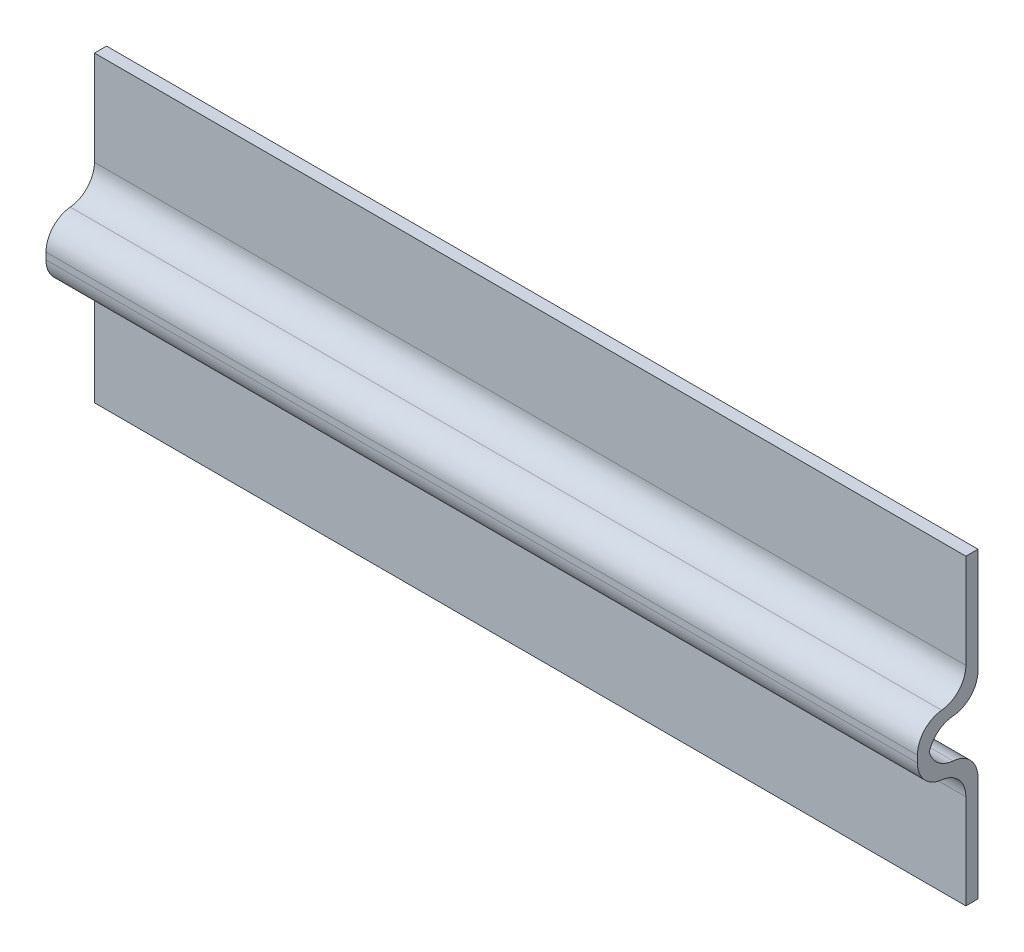
ISO-10303-21;
HEADER;
FILE_DESCRIPTION(('STEP AP214'),'2;1');
FILE_NAME('part.step','',(''),(''),'','','');
FILE_SCHEMA(('AUTOMOTIVE_DESIGN { 1 0 10303 214 1 1 1 1 }'));
ENDSEC;
DATA;
#1=APPLICATION_CONTEXT('core data for automotive mechanical design processes');
#2=APPLICATION_PROTOCOL_DEFINITION('international standard','automotive_design',2000,#1);
#3=PRODUCT_CONTEXT('',#1,'mechanical');
#4=PRODUCT('Part','Part','',(#3));
#5=PRODUCT_RELATED_PRODUCT_CATEGORY('part','',(#4));
#6=PRODUCT_DEFINITION_FORMATION('','',#4);
#7=PRODUCT_DEFINITION_CONTEXT('part definition',#1,'design');
#8=PRODUCT_DEFINITION('design','',#6,#7);
#9=PRODUCT_DEFINITION_SHAPE('','',#8);
#10=(LENGTH_UNIT() NAMED_UNIT(*) SI_UNIT(.MILLI.,.METRE.));
#11=(NAMED_UNIT(*) PLANE_ANGLE_UNIT() SI_UNIT($,.RADIAN.));
#12=(NAMED_UNIT(*) SI_UNIT($,.STERADIAN.) SOLID_ANGLE_UNIT());
#13=UNCERTAINTY_MEASURE_WITH_UNIT(LENGTH_MEASURE(1.E-05),#10,'distance_accuracy_value','');
#14=(GEOMETRIC_REPRESENTATION_CONTEXT(3) GLOBAL_UNCERTAINTY_ASSIGNED_CONTEXT((#13)) GLOBAL_UNIT_ASSIGNED_CONTEXT((#10,
#11,#12)) REPRESENTATION_CONTEXT('',''));
#15=CARTESIAN_POINT('',(0.,0.,0.));
#16=DIRECTION('',(0.,0.,1.));
#17=DIRECTION('',(1.,0.,0.));
#18=AXIS2_PLACEMENT_3D('',#15,#16,#17);
#19=CARTESIAN_POINT('',(-161.965,0.,0.));
#20=DIRECTION('',(0.,0.,-1.));
#21=DIRECTION('',(0.,1.,0.));
#22=AXIS2_PLACEMENT_3D('',#19,#20,#21);
#23=PLANE('',#22);
#24=DIRECTION('',(0.,1.,0.));
#25=VECTOR('',#24,1.);
#26=CARTESIAN_POINT('',(-161.965,0.,0.));
#27=LINE('',#26,#25);
#28=CARTESIAN_POINT('',(-161.965,0.,0.));
#29=VERTEX_POINT('',#28);
#30=CARTESIAN_POINT('',(-161.965,39.0937012998243,0.));
#31=VERTEX_POINT('',#30);
#32=EDGE_CURVE('E161',#29,#31,#27,.T.);
#33=ORIENTED_EDGE('',*,*,#32,.T.);
#34=DIRECTION('',(1.,0.,0.));
#35=VECTOR('',#34,1.);
#36=CARTESIAN_POINT('',(161.965,39.0937012998243,0.));
#37=LINE('',#36,#35);
#38=CARTESIAN_POINT('',(161.965,39.0937012998243,0.));
#39=VERTEX_POINT('',#38);
#40=EDGE_CURVE('E247',#31,#39,#37,.T.);
#41=ORIENTED_EDGE('',*,*,#40,.T.);
#42=DIRECTION('',(0.,1.,0.));
#43=VECTOR('',#42,1.);
#44=CARTESIAN_POINT('',(161.965,0.,0.));
#45=LINE('',#44,#43);
#46=CARTESIAN_POINT('',(161.965,0.,0.));
#47=VERTEX_POINT('',#46);
#48=EDGE_CURVE('E186',#47,#39,#45,.T.);
#49=ORIENTED_EDGE('',*,*,#48,.F.);
#50=DIRECTION('',(1.,0.,0.));
#51=VECTOR('',#50,1.);
#52=CARTESIAN_POINT('',(-161.965,0.,0.));
#53=LINE('',#52,#51);
#54=EDGE_CURVE('E203',#29,#47,#53,.T.);
#55=ORIENTED_EDGE('',*,*,#54,.F.);
#56=EDGE_LOOP('',(#33,#41,#49,#55));
#57=FACE_BOUND('',#56,.T.);
#58=ADVANCED_FACE('F43',(#57),#23,.T.);
#59=CARTESIAN_POINT('',(-161.965,0.,0.));
#60=DIRECTION('',(0.,-1.,0.));
#61=DIRECTION('',(0.,0.,-1.));
#62=AXIS2_PLACEMENT_3D('',#59,#60,#61);
#63=PLANE('',#62);
#64=DIRECTION('',(0.,0.,-1.));
#65=VECTOR('',#64,1.);
#66=CARTESIAN_POINT('',(161.965,0.,0.));
#67=LINE('',#66,#65);
#68=CARTESIAN_POINT('',(161.965,0.,4.50388224287594));
#69=VERTEX_POINT('',#68);
#70=EDGE_CURVE('E200',#69,#47,#67,.T.);
#71=ORIENTED_EDGE('',*,*,#70,.F.);
#72=DIRECTION('',(1.,0.,0.));
#73=VECTOR('',#72,1.);
#74=CARTESIAN_POINT('',(-161.965,0.,4.50388224287594));
#75=LINE('',#74,#73);
#76=CARTESIAN_POINT('',(-161.965,0.,4.50388224287594));
#77=VERTEX_POINT('',#76);
#78=EDGE_CURVE('E206',#77,#69,#75,.T.);
#79=ORIENTED_EDGE('',*,*,#78,.F.);
#80=DIRECTION('',(0.,0.,-1.));
#81=VECTOR('',#80,1.);
#82=CARTESIAN_POINT('',(-161.965,0.,0.));
#83=LINE('',#82,#81);
#84=EDGE_CURVE('E169',#77,#29,#83,.T.);
#85=ORIENTED_EDGE('',*,*,#84,.T.);
#86=ORIENTED_EDGE('',*,*,#54,.T.);
#87=EDGE_LOOP('',(#71,#79,#85,#86));
#88=FACE_BOUND('',#87,.T.);
#89=ADVANCED_FACE('F296',(#88),#63,.T.);
#90=CARTESIAN_POINT('',(-161.965,0.,4.50388224287594));
#91=DIRECTION('',(0.,0.,1.));
#92=DIRECTION('',(0.,-1.,0.));
#93=AXIS2_PLACEMENT_3D('',#90,#91,#92);
#94=PLANE('',#93);
#95=DIRECTION('',(0.,-1.,0.));
#96=VECTOR('',#95,1.);
#97=CARTESIAN_POINT('',(161.965,0.,4.50388224287594));
#98=LINE('',#97,#96);
#99=CARTESIAN_POINT('',(161.965,35.1375190860871,4.50388224287594));
#100=VERTEX_POINT('',#99);
#101=EDGE_CURVE('E198',#100,#69,#98,.T.);
#102=ORIENTED_EDGE('',*,*,#101,.F.);
#103=DIRECTION('',(-1.,0.,0.));
#104=VECTOR('',#103,1.);
#105=CARTESIAN_POINT('',(-161.965,35.1375190860871,4.50388224287594));
#106=LINE('',#105,#104);
#107=CARTESIAN_POINT('',(-161.965,35.1375190860871,4.50388224287594));
#108=VERTEX_POINT('',#107);
#109=EDGE_CURVE('E255',#100,#108,#106,.T.);
#110=ORIENTED_EDGE('',*,*,#109,.T.);
#111=DIRECTION('',(0.,-1.,0.));
#112=VECTOR('',#111,1.);
#113=CARTESIAN_POINT('',(-161.965,0.,4.50388224287594));
#114=LINE('',#113,#112);
#115=EDGE_CURVE('E182',#108,#77,#114,.T.);
#116=ORIENTED_EDGE('',*,*,#115,.T.);
#117=ORIENTED_EDGE('',*,*,#78,.T.);
#118=EDGE_LOOP('',(#102,#110,#116,#117));
#119=FACE_BOUND('',#118,.T.);
#120=ADVANCED_FACE('F327',(#119),#94,.T.);
#121=CARTESIAN_POINT('',(-161.965,67.5582336431391,22.5194112143797));
#122=DIRECTION('',(0.,0.,1.));
#123=DIRECTION('',(1.,0.,0.));
#124=AXIS2_PLACEMENT_3D('',#121,#122,#123);
#125=PLANE('',#124);
#126=DIRECTION('',(0.,-1.,0.));
#127=VECTOR('',#126,1.);
#128=CARTESIAN_POINT('',(-161.965,67.5582336431391,22.5194112143797));
#129=LINE('',#128,#127);
#130=CARTESIAN_POINT('',(-161.965,57.5582336431391,22.5194112143797));
#131=VERTEX_POINT('',#130);
#132=CARTESIAN_POINT('',(-161.965,55.0388224287594,22.5194112143797));
#133=VERTEX_POINT('',#132);
#134=EDGE_CURVE('E176',#131,#133,#129,.T.);
#135=ORIENTED_EDGE('',*,*,#134,.T.);
#136=DIRECTION('',(1.,0.,0.));
#137=VECTOR('',#136,1.);
#138=CARTESIAN_POINT('',(-161.965,55.0388224287594,22.5194112143797));
#139=LINE('',#138,#137);
#140=CARTESIAN_POINT('',(161.965,55.0388224287594,22.5194112143797));
#141=VERTEX_POINT('',#140);
#142=EDGE_CURVE('E211',#133,#141,#139,.T.);
#143=ORIENTED_EDGE('',*,*,#142,.T.);
#144=DIRECTION('',(0.,-1.,0.));
#145=VECTOR('',#144,1.);
#146=CARTESIAN_POINT('',(161.965,67.5582336431391,22.5194112143797));
#147=LINE('',#146,#145);
#148=CARTESIAN_POINT('',(161.965,57.5582336431391,22.5194112143797));
#149=VERTEX_POINT('',#148);
#150=EDGE_CURVE('E195',#149,#141,#147,.T.);
#151=ORIENTED_EDGE('',*,*,#150,.F.);
#152=DIRECTION('',(1.,0.,0.));
#153=VECTOR('',#152,1.);
#154=CARTESIAN_POINT('',(-161.965,57.5582336431391,22.5194112143797));
#155=LINE('',#154,#153);
#156=EDGE_CURVE('E205',#149,#131,#155,.F.);
#157=ORIENTED_EDGE('',*,*,#156,.T.);
#158=EDGE_LOOP('',(#135,#143,#151,#157));
#159=FACE_BOUND('',#158,.T.);
#160=ADVANCED_FACE('F312',(#159),#125,.T.);
#161=CARTESIAN_POINT('',(-161.965,67.5582336431391,4.50388224287594));
#162=DIRECTION('',(0.,0.,1.));
#163=DIRECTION('',(0.,-1.,0.));
#164=AXIS2_PLACEMENT_3D('',#161,#162,#163);
#165=PLANE('',#164);
#166=DIRECTION('',(0.,-1.,0.));
#167=VECTOR('',#166,1.);
#168=CARTESIAN_POINT('',(-161.965,67.5582336431391,4.50388224287594));
#169=LINE('',#168,#167);
#170=CARTESIAN_POINT('',(-161.965,112.597056071899,4.50388224287594));
#171=VERTEX_POINT('',#170);
#172=CARTESIAN_POINT('',(-161.965,77.4595369858114,4.50388224287594));
#173=VERTEX_POINT('',#172);
#174=EDGE_CURVE('E174',#171,#173,#169,.T.);
#175=ORIENTED_EDGE('',*,*,#174,.T.);
#176=DIRECTION('',(-1.,0.,0.));
#177=VECTOR('',#176,1.);
#178=CARTESIAN_POINT('',(161.965,77.4595369858114,4.50388224287594));
#179=LINE('',#178,#177);
#180=CARTESIAN_POINT('',(161.965,77.4595369858114,4.50388224287594));
#181=VERTEX_POINT('',#180);
#182=EDGE_CURVE('E261',#173,#181,#179,.F.);
#183=ORIENTED_EDGE('',*,*,#182,.T.);
#184=DIRECTION('',(0.,-1.,0.));
#185=VECTOR('',#184,1.);
#186=CARTESIAN_POINT('',(161.965,67.5582336431391,4.50388224287594));
#187=LINE('',#186,#185);
#188=CARTESIAN_POINT('',(161.965,112.597056071899,4.50388224287594));
#189=VERTEX_POINT('',#188);
#190=EDGE_CURVE('E193',#189,#181,#187,.T.);
#191=ORIENTED_EDGE('',*,*,#190,.F.);
#192=DIRECTION('',(1.,0.,0.));
#193=VECTOR('',#192,1.);
#194=CARTESIAN_POINT('',(-161.965,112.597056071899,4.50388224287594));
#195=LINE('',#194,#193);
#196=EDGE_CURVE('E168',#171,#189,#195,.T.);
#197=ORIENTED_EDGE('',*,*,#196,.F.);
#198=EDGE_LOOP('',(#175,#183,#191,#197));
#199=FACE_BOUND('',#198,.T.);
#200=ADVANCED_FACE('F267',(#199),#165,.T.);
#201=CARTESIAN_POINT('',(-161.965,112.597056071899,0.));
#202=DIRECTION('',(0.,1.,0.));
#203=DIRECTION('',(0.,0.,1.));
#204=AXIS2_PLACEMENT_3D('',#201,#202,#203);
#205=PLANE('',#204);
#206=DIRECTION('',(0.,0.,1.));
#207=VECTOR('',#206,1.);
#208=CARTESIAN_POINT('',(161.965,112.597056071899,0.));
#209=LINE('',#208,#207);
#210=CARTESIAN_POINT('',(161.965,112.597056071899,0.));
#211=VERTEX_POINT('',#210);
#212=EDGE_CURVE('E167',#211,#189,#209,.T.);
#213=ORIENTED_EDGE('',*,*,#212,.F.);
#214=DIRECTION('',(1.,0.,0.));
#215=VECTOR('',#214,1.);
#216=CARTESIAN_POINT('',(-161.965,112.597056071899,0.));
#217=LINE('',#216,#215);
#218=CARTESIAN_POINT('',(-161.965,112.597056071899,0.));
#219=VERTEX_POINT('',#218);
#220=EDGE_CURVE('E153',#219,#211,#217,.T.);
#221=ORIENTED_EDGE('',*,*,#220,.F.);
#222=DIRECTION('',(0.,0.,1.));
#223=VECTOR('',#222,1.);
#224=CARTESIAN_POINT('',(-161.965,112.597056071899,0.));
#225=LINE('',#224,#223);
#226=EDGE_CURVE('E160',#219,#171,#225,.T.);
#227=ORIENTED_EDGE('',*,*,#226,.T.);
#228=ORIENTED_EDGE('',*,*,#196,.T.);
#229=EDGE_LOOP('',(#213,#221,#227,#228));
#230=FACE_BOUND('',#229,.T.);
#231=ADVANCED_FACE('F165',(#230),#205,.T.);
#232=CARTESIAN_POINT('',(-161.965,63.5582336431391,0.));
#233=DIRECTION('',(0.,0.,-1.));
#234=DIRECTION('',(-1.,0.,0.));
#235=AXIS2_PLACEMENT_3D('',#232,#233,#234);
#236=PLANE('',#235);
#237=DIRECTION('',(0.,1.,0.));
#238=VECTOR('',#237,1.);
#239=CARTESIAN_POINT('',(161.965,63.5582336431391,0.));
#240=LINE('',#239,#238);
#241=CARTESIAN_POINT('',(161.965,73.5033547720743,0.));
#242=VERTEX_POINT('',#241);
#243=EDGE_CURVE('E189',#242,#211,#240,.T.);
#244=ORIENTED_EDGE('',*,*,#243,.F.);
#245=DIRECTION('',(1.,0.,0.));
#246=VECTOR('',#245,1.);
#247=CARTESIAN_POINT('',(-161.965,73.5033547720743,0.));
#248=LINE('',#247,#246);
#249=CARTESIAN_POINT('',(-161.965,73.5033547720743,0.));
#250=VERTEX_POINT('',#249);
#251=EDGE_CURVE('E156',#242,#250,#248,.F.);
#252=ORIENTED_EDGE('',*,*,#251,.T.);
#253=DIRECTION('',(0.,1.,0.));
#254=VECTOR('',#253,1.);
#255=CARTESIAN_POINT('',(-161.965,63.5582336431391,0.));
#256=LINE('',#255,#254);
#257=EDGE_CURVE('E149',#250,#219,#256,.T.);
#258=ORIENTED_EDGE('',*,*,#257,.T.);
#259=ORIENTED_EDGE('',*,*,#220,.T.);
#260=EDGE_LOOP('',(#244,#252,#258,#259));
#261=FACE_BOUND('',#260,.T.);
#262=ADVANCED_FACE('F152',(#261),#236,.T.);
#263=CARTESIAN_POINT('',(-161.965,0.,0.));
#264=DIRECTION('',(-1.,0.,0.));
#265=DIRECTION('',(0.,0.,1.));
#266=AXIS2_PLACEMENT_3D('',#263,#264,#265);
#267=PLANE('',#266);
#268=ORIENTED_EDGE('',*,*,#257,.F.);
#269=CARTESIAN_POINT('',(-161.965,73.5033547720743,10.));
#270=DIRECTION('',(-1.,0.,0.));
#271=DIRECTION('',(0.,0.,1.));
#272=AXIS2_PLACEMENT_3D('',#269,#270,#271);
#273=CIRCLE('',#272,10.);
#274=CARTESIAN_POINT('',(-161.965,63.5307942076067,9.25970560718985));
#275=VERTEX_POINT('',#274);
#276=EDGE_CURVE('E245',#250,#275,#273,.T.);
#277=ORIENTED_EDGE('',*,*,#276,.T.);
#278=CARTESIAN_POINT('',(-161.965,53.5582336431391,8.51941121437971));
#279=DIRECTION('',(-1.,0.,0.));
#280=DIRECTION('',(0.,0.,1.));
#281=AXIS2_PLACEMENT_3D('',#278,#279,#280);
#282=CIRCLE('',#281,10.);
#283=CARTESIAN_POINT('',(-161.965,56.2985280359493,18.1366242535472));
#284=VERTEX_POINT('',#283);
#285=EDGE_CURVE('E231',#275,#284,#282,.F.);
#286=ORIENTED_EDGE('',*,*,#285,.T.);
#287=CARTESIAN_POINT('',(-161.965,59.0388224287594,8.51941121437971));
#288=DIRECTION('',(-1.,0.,0.));
#289=DIRECTION('',(0.,0.,1.));
#290=AXIS2_PLACEMENT_3D('',#287,#288,#289);
#291=CIRCLE('',#290,10.);
#292=CARTESIAN_POINT('',(-161.965,49.0662618642918,9.25970560718985));
#293=VERTEX_POINT('',#292);
#294=EDGE_CURVE('E225',#284,#293,#291,.F.);
#295=ORIENTED_EDGE('',*,*,#294,.T.);
#296=CARTESIAN_POINT('',(-161.965,39.0937012998243,9.99999999999999));
#297=DIRECTION('',(-1.,0.,0.));
#298=DIRECTION('',(0.,0.,1.));
#299=AXIS2_PLACEMENT_3D('',#296,#297,#298);
#300=CIRCLE('',#299,10.);
#301=EDGE_CURVE('E243',#293,#31,#300,.T.);
#302=ORIENTED_EDGE('',*,*,#301,.T.);
#303=ORIENTED_EDGE('',*,*,#32,.F.);
#304=ORIENTED_EDGE('',*,*,#84,.F.);
#305=ORIENTED_EDGE('',*,*,#115,.F.);
#306=CARTESIAN_POINT('',(-161.965,35.1375190860871,14.5038822428759));
#307=DIRECTION('',(-1.,0.,0.));
#308=DIRECTION('',(0.,0.,1.));
#309=AXIS2_PLACEMENT_3D('',#306,#307,#308);
#310=CIRCLE('',#309,10.);
#311=CARTESIAN_POINT('',(-161.965,45.0881707574233,13.5116467286278));
#312=VERTEX_POINT('',#311);
#313=EDGE_CURVE('E259',#108,#312,#310,.F.);
#314=ORIENTED_EDGE('',*,*,#313,.T.);
#315=CARTESIAN_POINT('',(-161.965,55.0388224287594,12.5194112143797));
#316=DIRECTION('',(-1.,0.,0.));
#317=DIRECTION('',(0.,0.,1.));
#318=AXIS2_PLACEMENT_3D('',#315,#316,#317);
#319=CIRCLE('',#318,10.);
#320=EDGE_CURVE('E221',#312,#133,#319,.T.);
#321=ORIENTED_EDGE('',*,*,#320,.T.);
#322=ORIENTED_EDGE('',*,*,#134,.F.);
#323=CARTESIAN_POINT('',(-161.965,57.5582336431391,12.5194112143797));
#324=DIRECTION('',(-1.,0.,0.));
#325=DIRECTION('',(0.,0.,1.));
#326=AXIS2_PLACEMENT_3D('',#323,#324,#325);
#327=CIRCLE('',#326,10.);
#328=CARTESIAN_POINT('',(-161.965,67.5088853144753,13.5116467286278));
#329=VERTEX_POINT('',#328);
#330=EDGE_CURVE('E219',#131,#329,#327,.T.);
#331=ORIENTED_EDGE('',*,*,#330,.T.);
#332=CARTESIAN_POINT('',(-161.965,77.4595369858114,14.5038822428759));
#333=DIRECTION('',(-1.,0.,0.));
#334=DIRECTION('',(0.,0.,1.));
#335=AXIS2_PLACEMENT_3D('',#332,#333,#334);
#336=CIRCLE('',#335,10.);
#337=EDGE_CURVE('E11',#329,#173,#336,.F.);
#338=ORIENTED_EDGE('',*,*,#337,.T.);
#339=ORIENTED_EDGE('',*,*,#174,.F.);
#340=ORIENTED_EDGE('',*,*,#226,.F.);
#341=EDGE_LOOP('',(#268,#277,#286,#295,#302,#303,#304,#305,#314,#321,#322,#331,#338,#339,#340));
#342=FACE_BOUND('',#341,.T.);
#343=ADVANCED_FACE('F172',(#342),#267,.T.);
#344=CARTESIAN_POINT('',(161.965,0.,0.));
#345=DIRECTION('',(-1.,0.,0.));
#346=DIRECTION('',(0.,0.,1.));
#347=AXIS2_PLACEMENT_3D('',#344,#345,#346);
#348=PLANE('',#347);
#349=CARTESIAN_POINT('',(161.965,53.5582336431391,8.51941121437971));
#350=DIRECTION('',(-1.,0.,0.));
#351=DIRECTION('',(0.,0.,1.));
#352=AXIS2_PLACEMENT_3D('',#349,#350,#351);
#353=CIRCLE('',#352,10.);
#354=CARTESIAN_POINT('',(161.965,56.2985280359493,18.1366242535472));
#355=VERTEX_POINT('',#354);
#356=CARTESIAN_POINT('',(161.965,63.5307942076067,9.25970560718985));
#357=VERTEX_POINT('',#356);
#358=EDGE_CURVE('E228',#355,#357,#353,.T.);
#359=ORIENTED_EDGE('',*,*,#358,.T.);
#360=CARTESIAN_POINT('',(161.965,73.5033547720743,10.));
#361=DIRECTION('',(-1.,0.,0.));
#362=DIRECTION('',(0.,0.,1.));
#363=AXIS2_PLACEMENT_3D('',#360,#361,#362);
#364=CIRCLE('',#363,10.);
#365=EDGE_CURVE('E240',#357,#242,#364,.F.);
#366=ORIENTED_EDGE('',*,*,#365,.T.);
#367=ORIENTED_EDGE('',*,*,#243,.T.);
#368=ORIENTED_EDGE('',*,*,#212,.T.);
#369=ORIENTED_EDGE('',*,*,#190,.T.);
#370=CARTESIAN_POINT('',(161.965,77.4595369858114,14.5038822428759));
#371=DIRECTION('',(-1.,0.,0.));
#372=DIRECTION('',(0.,0.,1.));
#373=AXIS2_PLACEMENT_3D('',#370,#371,#372);
#374=CIRCLE('',#373,10.);
#375=CARTESIAN_POINT('',(161.965,67.5088853144753,13.5116467286278));
#376=VERTEX_POINT('',#375);
#377=EDGE_CURVE('E51',#181,#376,#374,.T.);
#378=ORIENTED_EDGE('',*,*,#377,.T.);
#379=CARTESIAN_POINT('',(161.965,57.5582336431391,12.5194112143797));
#380=DIRECTION('',(-1.,0.,0.));
#381=DIRECTION('',(0.,0.,1.));
#382=AXIS2_PLACEMENT_3D('',#379,#380,#381);
#383=CIRCLE('',#382,10.);
#384=EDGE_CURVE('E214',#376,#149,#383,.F.);
#385=ORIENTED_EDGE('',*,*,#384,.T.);
#386=ORIENTED_EDGE('',*,*,#150,.T.);
#387=CARTESIAN_POINT('',(161.965,55.0388224287594,12.5194112143797));
#388=DIRECTION('',(-1.,0.,0.));
#389=DIRECTION('',(0.,0.,1.));
#390=AXIS2_PLACEMENT_3D('',#387,#388,#389);
#391=CIRCLE('',#390,10.);
#392=CARTESIAN_POINT('',(161.965,45.0881707574233,13.5116467286278));
#393=VERTEX_POINT('',#392);
#394=EDGE_CURVE('E216',#141,#393,#391,.F.);
#395=ORIENTED_EDGE('',*,*,#394,.T.);
#396=CARTESIAN_POINT('',(161.965,35.1375190860871,14.5038822428759));
#397=DIRECTION('',(-1.,0.,0.));
#398=DIRECTION('',(0.,0.,1.));
#399=AXIS2_PLACEMENT_3D('',#396,#397,#398);
#400=CIRCLE('',#399,10.);
#401=EDGE_CURVE('E257',#393,#100,#400,.T.);
#402=ORIENTED_EDGE('',*,*,#401,.T.);
#403=ORIENTED_EDGE('',*,*,#101,.T.);
#404=ORIENTED_EDGE('',*,*,#70,.T.);
#405=ORIENTED_EDGE('',*,*,#48,.T.);
#406=CARTESIAN_POINT('',(161.965,39.0937012998243,9.99999999999999));
#407=DIRECTION('',(-1.,0.,0.));
#408=DIRECTION('',(0.,0.,1.));
#409=AXIS2_PLACEMENT_3D('',#406,#407,#408);
#410=CIRCLE('',#409,10.);
#411=CARTESIAN_POINT('',(161.965,49.0662618642918,9.25970560718985));
#412=VERTEX_POINT('',#411);
#413=EDGE_CURVE('E238',#39,#412,#410,.F.);
#414=ORIENTED_EDGE('',*,*,#413,.T.);
#415=CARTESIAN_POINT('',(161.965,59.0388224287594,8.51941121437971));
#416=DIRECTION('',(-1.,0.,0.));
#417=DIRECTION('',(0.,0.,1.));
#418=AXIS2_PLACEMENT_3D('',#415,#416,#417);
#419=CIRCLE('',#418,10.);
#420=EDGE_CURVE('E223',#412,#355,#419,.T.);
#421=ORIENTED_EDGE('',*,*,#420,.T.);
#422=EDGE_LOOP('',(#359,#366,#367,#368,#369,#378,#385,#386,#395,#402,#403,#404,#405,#414,#421));
#423=FACE_BOUND('',#422,.T.);
#424=ADVANCED_FACE('F270',(#423),#348,.F.);
#425=CARTESIAN_POINT('',(-161.965,55.0388224287594,12.5194112143797));
#426=DIRECTION('',(1.,0.,0.));
#427=DIRECTION('',(0.,0.,-1.));
#428=AXIS2_PLACEMENT_3D('',#425,#426,#427);
#429=CYLINDRICAL_SURFACE('',#428,10.);
#430=ORIENTED_EDGE('',*,*,#320,.F.);
#431=DIRECTION('',(1.,0.,0.));
#432=VECTOR('',#431,1.);
#433=CARTESIAN_POINT('',(-161.965,45.0881707574233,13.5116467286278));
#434=LINE('',#433,#432);
#435=EDGE_CURVE('E252',#312,#393,#434,.T.);
#436=ORIENTED_EDGE('',*,*,#435,.T.);
#437=ORIENTED_EDGE('',*,*,#394,.F.);
#438=ORIENTED_EDGE('',*,*,#142,.F.);
#439=EDGE_LOOP('',(#430,#436,#437,#438));
#440=FACE_BOUND('',#439,.T.);
#441=ADVANCED_FACE('F307',(#440),#429,.T.);
#442=CARTESIAN_POINT('',(-161.965,57.5582336431391,12.5194112143797));
#443=DIRECTION('',(1.,0.,0.));
#444=DIRECTION('',(0.,0.,-1.));
#445=AXIS2_PLACEMENT_3D('',#442,#443,#444);
#446=CYLINDRICAL_SURFACE('',#445,10.);
#447=ORIENTED_EDGE('',*,*,#384,.F.);
#448=DIRECTION('',(1.,0.,0.));
#449=VECTOR('',#448,1.);
#450=CARTESIAN_POINT('',(-161.965,67.5088853144753,13.5116467286278));
#451=LINE('',#450,#449);
#452=EDGE_CURVE('E64',#376,#329,#451,.F.);
#453=ORIENTED_EDGE('',*,*,#452,.T.);
#454=ORIENTED_EDGE('',*,*,#330,.F.);
#455=ORIENTED_EDGE('',*,*,#156,.F.);
#456=EDGE_LOOP('',(#447,#453,#454,#455));
#457=FACE_BOUND('',#456,.T.);
#458=ADVANCED_FACE('F314',(#457),#446,.T.);
#459=CARTESIAN_POINT('',(-161.965,53.5582336431391,8.51941121437971));
#460=DIRECTION('',(-1.,0.,0.));
#461=DIRECTION('',(0.,0.,1.));
#462=AXIS2_PLACEMENT_3D('',#459,#460,#461);
#463=CYLINDRICAL_SURFACE('',#462,10.);
#464=ORIENTED_EDGE('',*,*,#285,.F.);
#465=DIRECTION('',(-1.,0.,0.));
#466=VECTOR('',#465,1.);
#467=CARTESIAN_POINT('',(-161.965,63.5307942076067,9.25970560718985));
#468=LINE('',#467,#466);
#469=EDGE_CURVE('E233',#275,#357,#468,.F.);
#470=ORIENTED_EDGE('',*,*,#469,.T.);
#471=ORIENTED_EDGE('',*,*,#358,.F.);
#472=DIRECTION('',(-1.,0.,0.));
#473=VECTOR('',#472,1.);
#474=CARTESIAN_POINT('',(0.,56.2985280359493,18.1366242535472));
#475=LINE('',#474,#473);
#476=EDGE_CURVE('E190',#284,#355,#475,.F.);
#477=ORIENTED_EDGE('',*,*,#476,.F.);
#478=EDGE_LOOP('',(#464,#470,#471,#477));
#479=FACE_BOUND('',#478,.T.);
#480=ADVANCED_FACE('F277',(#479),#463,.F.);
#481=CARTESIAN_POINT('',(-161.965,59.0388224287594,8.51941121437971));
#482=DIRECTION('',(-1.,0.,0.));
#483=DIRECTION('',(0.,0.,1.));
#484=AXIS2_PLACEMENT_3D('',#481,#482,#483);
#485=CYLINDRICAL_SURFACE('',#484,10.);
#486=ORIENTED_EDGE('',*,*,#420,.F.);
#487=DIRECTION('',(-1.,0.,0.));
#488=VECTOR('',#487,1.);
#489=CARTESIAN_POINT('',(-161.965,49.0662618642918,9.25970560718985));
#490=LINE('',#489,#488);
#491=EDGE_CURVE('E250',#412,#293,#490,.T.);
#492=ORIENTED_EDGE('',*,*,#491,.T.);
#493=ORIENTED_EDGE('',*,*,#294,.F.);
#494=ORIENTED_EDGE('',*,*,#476,.T.);
#495=EDGE_LOOP('',(#486,#492,#493,#494));
#496=FACE_BOUND('',#495,.T.);
#497=ADVANCED_FACE('F282',(#496),#485,.F.);
#498=CARTESIAN_POINT('',(-161.965,73.5033547720743,10.));
#499=DIRECTION('',(-1.,0.,0.));
#500=DIRECTION('',(0.,0.,1.));
#501=AXIS2_PLACEMENT_3D('',#498,#499,#500);
#502=CYLINDRICAL_SURFACE('',#501,10.);
#503=ORIENTED_EDGE('',*,*,#276,.F.);
#504=ORIENTED_EDGE('',*,*,#251,.F.);
#505=ORIENTED_EDGE('',*,*,#365,.F.);
#506=ORIENTED_EDGE('',*,*,#469,.F.);
#507=EDGE_LOOP('',(#503,#504,#505,#506));
#508=FACE_BOUND('',#507,.T.);
#509=ADVANCED_FACE('F272',(#508),#502,.T.);
#510=CARTESIAN_POINT('',(-161.965,39.0937012998243,9.99999999999999));
#511=DIRECTION('',(-1.,0.,0.));
#512=DIRECTION('',(0.,0.,1.));
#513=AXIS2_PLACEMENT_3D('',#510,#511,#512);
#514=CYLINDRICAL_SURFACE('',#513,10.);
#515=ORIENTED_EDGE('',*,*,#301,.F.);
#516=ORIENTED_EDGE('',*,*,#491,.F.);
#517=ORIENTED_EDGE('',*,*,#413,.F.);
#518=ORIENTED_EDGE('',*,*,#40,.F.);
#519=EDGE_LOOP('',(#515,#516,#517,#518));
#520=FACE_BOUND('',#519,.T.);
#521=ADVANCED_FACE('F289',(#520),#514,.T.);
#522=CARTESIAN_POINT('',(-161.965,35.1375190860871,14.5038822428759));
#523=DIRECTION('',(1.,0.,0.));
#524=DIRECTION('',(0.,0.,-1.));
#525=AXIS2_PLACEMENT_3D('',#522,#523,#524);
#526=CYLINDRICAL_SURFACE('',#525,10.);
#527=ORIENTED_EDGE('',*,*,#313,.F.);
#528=ORIENTED_EDGE('',*,*,#109,.F.);
#529=ORIENTED_EDGE('',*,*,#401,.F.);
#530=ORIENTED_EDGE('',*,*,#435,.F.);
#531=EDGE_LOOP('',(#527,#528,#529,#530));
#532=FACE_BOUND('',#531,.T.);
#533=ADVANCED_FACE('F305',(#532),#526,.F.);
#534=CARTESIAN_POINT('',(-161.965,77.4595369858114,14.5038822428759));
#535=DIRECTION('',(1.,0.,0.));
#536=DIRECTION('',(0.,0.,-1.));
#537=AXIS2_PLACEMENT_3D('',#534,#535,#536);
#538=CYLINDRICAL_SURFACE('',#537,10.);
#539=ORIENTED_EDGE('',*,*,#337,.F.);
#540=ORIENTED_EDGE('',*,*,#452,.F.);
#541=ORIENTED_EDGE('',*,*,#377,.F.);
#542=ORIENTED_EDGE('',*,*,#182,.F.);
#543=EDGE_LOOP('',(#539,#540,#541,#542));
#544=FACE_BOUND('',#543,.T.);
#545=ADVANCED_FACE('F45',(#544),#538,.F.);
#546=CLOSED_SHELL('',(#58,#89,#120,#160,#200,#231,#262,#343,#424,#441,#458,#480,#497,#509,#521,
#533,#545));
#547=MANIFOLD_SOLID_BREP('B2',#546);
#548=ADVANCED_BREP_SHAPE_REPRESENTATION('',(#18,#547),#14);
#549=SHAPE_DEFINITION_REPRESENTATION(#9,#548);
ENDSEC;
END-ISO-10303-21;
